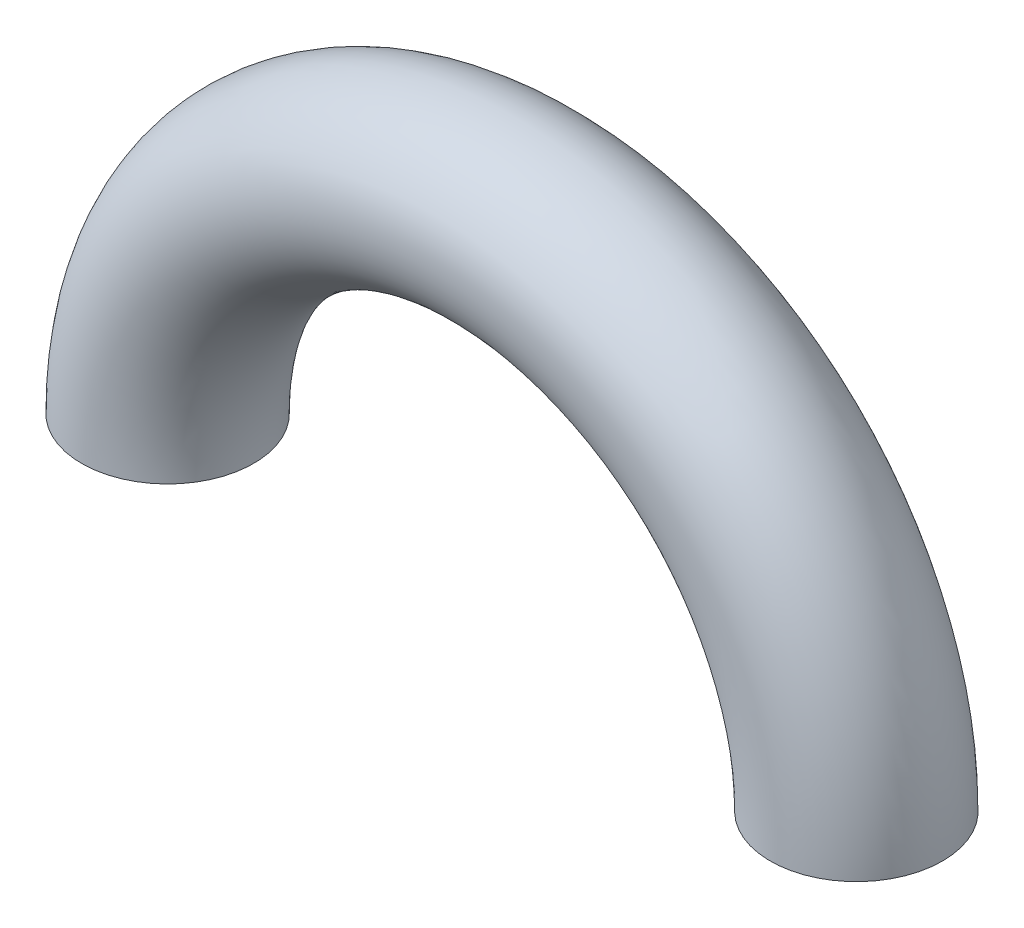
ISO-10303-21;
HEADER;
FILE_DESCRIPTION(('STEP AP214'),'2;1');
FILE_NAME('part.step','',(''),(''),'','','');
FILE_SCHEMA(('AUTOMOTIVE_DESIGN { 1 0 10303 214 1 1 1 1 }'));
ENDSEC;
DATA;
#1=APPLICATION_CONTEXT('core data for automotive mechanical design processes');
#2=APPLICATION_PROTOCOL_DEFINITION('international standard','automotive_design',2000,#1);
#3=PRODUCT_CONTEXT('',#1,'mechanical');
#4=PRODUCT('Part','Part','',(#3));
#5=PRODUCT_RELATED_PRODUCT_CATEGORY('part','',(#4));
#6=PRODUCT_DEFINITION_FORMATION('','',#4);
#7=PRODUCT_DEFINITION_CONTEXT('part definition',#1,'design');
#8=PRODUCT_DEFINITION('design','',#6,#7);
#9=PRODUCT_DEFINITION_SHAPE('','',#8);
#10=(LENGTH_UNIT() NAMED_UNIT(*) SI_UNIT(.MILLI.,.METRE.));
#11=(NAMED_UNIT(*) PLANE_ANGLE_UNIT() SI_UNIT($,.RADIAN.));
#12=(NAMED_UNIT(*) SI_UNIT($,.STERADIAN.) SOLID_ANGLE_UNIT());
#13=UNCERTAINTY_MEASURE_WITH_UNIT(LENGTH_MEASURE(1.E-05),#10,'distance_accuracy_value','');
#14=(GEOMETRIC_REPRESENTATION_CONTEXT(3) GLOBAL_UNCERTAINTY_ASSIGNED_CONTEXT((#13)) GLOBAL_UNIT_ASSIGNED_CONTEXT((#10,
#11,#12)) REPRESENTATION_CONTEXT('',''));
#15=CARTESIAN_POINT('',(0.,0.,0.));
#16=DIRECTION('',(0.,0.,1.));
#17=DIRECTION('',(1.,0.,0.));
#18=AXIS2_PLACEMENT_3D('',#15,#16,#17);
#19=CARTESIAN_POINT('',(20.,0.,0.));
#20=DIRECTION('',(0.,-1.,0.));
#21=DIRECTION('',(0.,0.,1.));
#22=AXIS2_PLACEMENT_3D('',#19,#20,#21);
#23=PLANE('',#22);
#24=CARTESIAN_POINT('',(20.,0.,0.));
#25=DIRECTION('',(0.,-1.,0.));
#26=DIRECTION('',(0.,0.,1.));
#27=AXIS2_PLACEMENT_3D('',#24,#25,#26);
#28=CIRCLE('',#27,2.5);
#29=CARTESIAN_POINT('',(22.5,0.,0.));
#30=VERTEX_POINT('',#29);
#31=EDGE_CURVE('E48',#30,#30,#28,.T.);
#32=ORIENTED_EDGE('',*,*,#31,.T.);
#33=EDGE_LOOP('',(#32));
#34=FACE_BOUND('',#33,.T.);
#35=ADVANCED_FACE('F41',(#34),#23,.T.);
#36=CARTESIAN_POINT('',(0.,0.,0.));
#37=DIRECTION('',(0.,1.,0.));
#38=DIRECTION('',(0.,0.,1.));
#39=AXIS2_PLACEMENT_3D('',#36,#37,#38);
#40=PLANE('',#39);
#41=CARTESIAN_POINT('',(0.,0.,0.));
#42=DIRECTION('',(0.,1.,0.));
#43=DIRECTION('',(0.,0.,1.));
#44=AXIS2_PLACEMENT_3D('',#41,#42,#43);
#45=CIRCLE('',#44,2.5);
#46=CARTESIAN_POINT('',(-2.5,0.,0.));
#47=VERTEX_POINT('',#46);
#48=EDGE_CURVE('E10',#47,#47,#45,.T.);
#49=ORIENTED_EDGE('',*,*,#48,.F.);
#50=EDGE_LOOP('',(#49));
#51=FACE_BOUND('',#50,.T.);
#52=ADVANCED_FACE('F60',(#51),#40,.F.);
#53=CARTESIAN_POINT('',(10.,0.,0.));
#54=DIRECTION('',(0.,0.,1.));
#55=DIRECTION('',(1.,0.,0.));
#56=AXIS2_PLACEMENT_3D('',#53,#54,#55);
#57=TOROIDAL_SURFACE('',#56,10.,2.5);
#58=CARTESIAN_POINT('',(10.,0.,0.));
#59=DIRECTION('',(0.,0.,1.));
#60=DIRECTION('',(1.,0.,0.));
#61=AXIS2_PLACEMENT_3D('',#58,#59,#60);
#62=CIRCLE('',#61,12.5);
#63=EDGE_CURVE('',#30,#47,#62,.T.);
#64=ORIENTED_EDGE('',*,*,#31,.F.);
#65=ORIENTED_EDGE('',*,*,#48,.T.);
#66=ORIENTED_EDGE('',*,*,#63,.T.);
#67=ORIENTED_EDGE('',*,*,#63,.F.);
#68=EDGE_LOOP('',(#64,#66,#65,#67));
#69=FACE_BOUND('',#68,.T.);
#70=ADVANCED_FACE('F58',(#69),#57,.T.);
#71=CLOSED_SHELL('',(#35,#52,#70));
#72=MANIFOLD_SOLID_BREP('B2',#71);
#73=ADVANCED_BREP_SHAPE_REPRESENTATION('',(#18,#72),#14);
#74=SHAPE_DEFINITION_REPRESENTATION(#9,#73);
ENDSEC;
END-ISO-10303-21;
